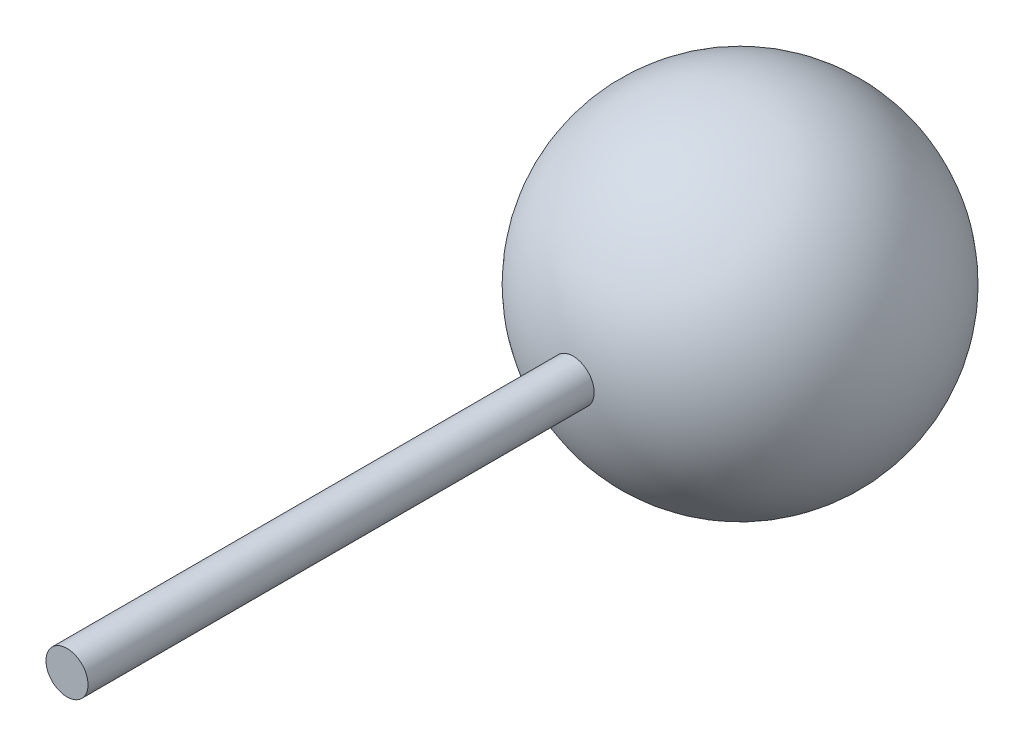
ISO-10303-21;
HEADER;
FILE_DESCRIPTION(('STEP AP214'),'2;1');
FILE_NAME('part.step','',(''),(''),'','','');
FILE_SCHEMA(('AUTOMOTIVE_DESIGN { 1 0 10303 214 1 1 1 1 }'));
ENDSEC;
DATA;
#1=APPLICATION_CONTEXT('core data for automotive mechanical design processes');
#2=APPLICATION_PROTOCOL_DEFINITION('international standard','automotive_design',2000,#1);
#3=PRODUCT_CONTEXT('',#1,'mechanical');
#4=PRODUCT('Part','Part','',(#3));
#5=PRODUCT_RELATED_PRODUCT_CATEGORY('part','',(#4));
#6=PRODUCT_DEFINITION_FORMATION('','',#4);
#7=PRODUCT_DEFINITION_CONTEXT('part definition',#1,'design');
#8=PRODUCT_DEFINITION('design','',#6,#7);
#9=PRODUCT_DEFINITION_SHAPE('','',#8);
#10=(LENGTH_UNIT() NAMED_UNIT(*) SI_UNIT(.MILLI.,.METRE.));
#11=(NAMED_UNIT(*) PLANE_ANGLE_UNIT() SI_UNIT($,.RADIAN.));
#12=(NAMED_UNIT(*) SI_UNIT($,.STERADIAN.) SOLID_ANGLE_UNIT());
#13=UNCERTAINTY_MEASURE_WITH_UNIT(LENGTH_MEASURE(1.E-05),#10,'distance_accuracy_value','');
#14=(GEOMETRIC_REPRESENTATION_CONTEXT(3) GLOBAL_UNCERTAINTY_ASSIGNED_CONTEXT((#13)) GLOBAL_UNIT_ASSIGNED_CONTEXT((#10,
#11,#12)) REPRESENTATION_CONTEXT('',''));
#15=CARTESIAN_POINT('',(0.,0.,0.));
#16=DIRECTION('',(0.,0.,1.));
#17=DIRECTION('',(1.,0.,0.));
#18=AXIS2_PLACEMENT_3D('',#15,#16,#17);
#19=CARTESIAN_POINT('',(0.,0.,0.));
#20=DIRECTION('',(0.,0.,-1.));
#21=DIRECTION('',(1.,0.,0.));
#22=AXIS2_PLACEMENT_3D('',#19,#20,#21);
#23=SPHERICAL_SURFACE('',#22,6.35);
#24=CARTESIAN_POINT('',(0.,0.,6.30019530947256));
#25=DIRECTION('',(0.,0.,-1.));
#26=DIRECTION('',(-1.,0.,0.));
#27=AXIS2_PLACEMENT_3D('',#24,#25,#26);
#28=CIRCLE('',#27,0.79375);
#29=CARTESIAN_POINT('',(-0.79375,0.,6.30019530947256));
#30=VERTEX_POINT('',#29);
#31=EDGE_CURVE('E10',#30,#30,#28,.F.);
#32=ORIENTED_EDGE('',*,*,#31,.F.);
#33=EDGE_LOOP('',(#32));
#34=FACE_BOUND('',#33,.T.);
#35=ADVANCED_FACE('F31',(#34),#23,.T.);
#36=CARTESIAN_POINT('',(0.,0.,25.4));
#37=DIRECTION('',(0.,0.,-1.));
#38=DIRECTION('',(-1.,0.,0.));
#39=AXIS2_PLACEMENT_3D('',#36,#37,#38);
#40=CYLINDRICAL_SURFACE('',#39,0.79375);
#41=CARTESIAN_POINT('',(0.,0.,25.4));
#42=DIRECTION('',(0.,0.,1.));
#43=DIRECTION('',(1.,0.,0.));
#44=AXIS2_PLACEMENT_3D('',#41,#42,#43);
#45=CIRCLE('',#44,0.79375);
#46=CARTESIAN_POINT('',(0.79375,0.,25.4));
#47=VERTEX_POINT('',#46);
#48=EDGE_CURVE('E37',#47,#47,#45,.T.);
#49=ORIENTED_EDGE('',*,*,#48,.F.);
#50=EDGE_LOOP('',(#49));
#51=FACE_BOUND('',#50,.T.);
#52=ORIENTED_EDGE('',*,*,#31,.T.);
#53=EDGE_LOOP('',(#52));
#54=FACE_BOUND('',#53,.T.);
#55=ADVANCED_FACE('F45',(#51,#54),#40,.T.);
#56=CARTESIAN_POINT('',(0.,0.,25.4));
#57=DIRECTION('',(0.,0.,1.));
#58=DIRECTION('',(1.,0.,0.));
#59=AXIS2_PLACEMENT_3D('',#56,#57,#58);
#60=PLANE('',#59);
#61=ORIENTED_EDGE('',*,*,#48,.T.);
#62=EDGE_LOOP('',(#61));
#63=FACE_BOUND('',#62,.T.);
#64=ADVANCED_FACE('F43',(#63),#60,.T.);
#65=CLOSED_SHELL('',(#35,#55,#64));
#66=MANIFOLD_SOLID_BREP('B2',#65);
#67=ADVANCED_BREP_SHAPE_REPRESENTATION('',(#18,#66),#14);
#68=SHAPE_DEFINITION_REPRESENTATION(#9,#67);
ENDSEC;
END-ISO-10303-21;
